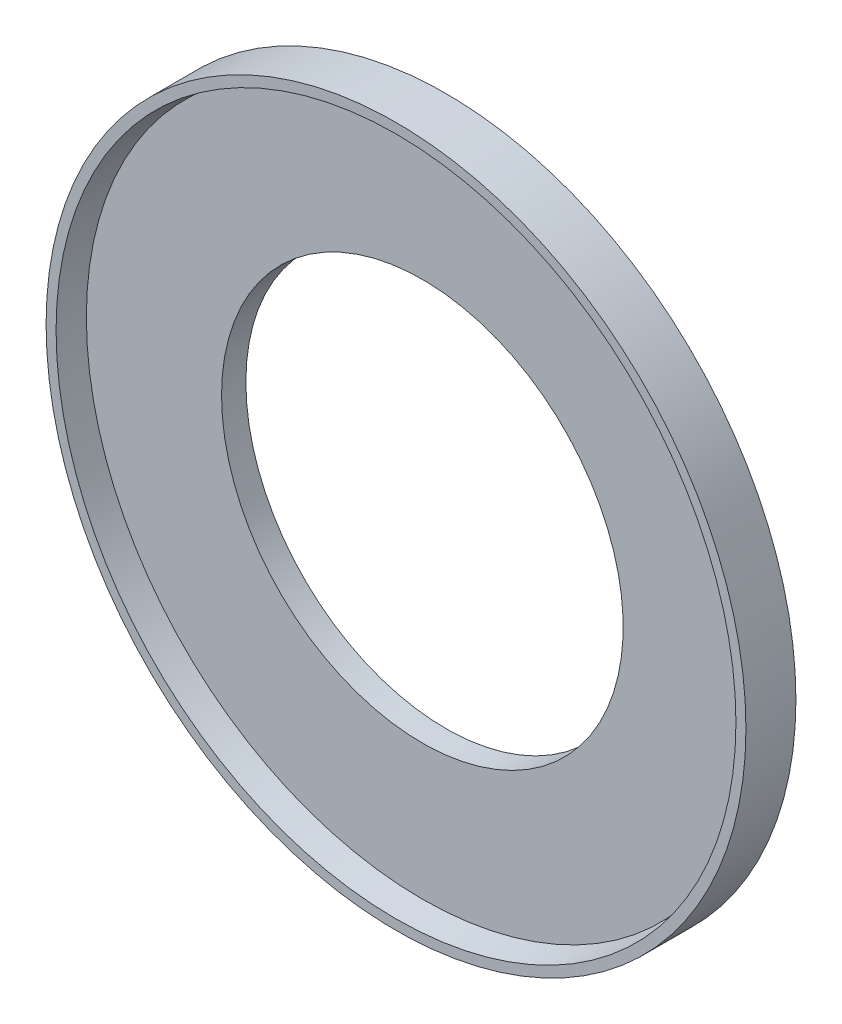
ISO-10303-21;
HEADER;
FILE_DESCRIPTION(('STEP AP214'),'2;1');
FILE_NAME('part.step','',(''),(''),'','','');
FILE_SCHEMA(('AUTOMOTIVE_DESIGN { 1 0 10303 214 1 1 1 1 }'));
ENDSEC;
DATA;
#1=APPLICATION_CONTEXT('core data for automotive mechanical design processes');
#2=APPLICATION_PROTOCOL_DEFINITION('international standard','automotive_design',2000,#1);
#3=PRODUCT_CONTEXT('',#1,'mechanical');
#4=PRODUCT('Part','Part','',(#3));
#5=PRODUCT_RELATED_PRODUCT_CATEGORY('part','',(#4));
#6=PRODUCT_DEFINITION_FORMATION('','',#4);
#7=PRODUCT_DEFINITION_CONTEXT('part definition',#1,'design');
#8=PRODUCT_DEFINITION('design','',#6,#7);
#9=PRODUCT_DEFINITION_SHAPE('','',#8);
#10=(LENGTH_UNIT() NAMED_UNIT(*) SI_UNIT(.MILLI.,.METRE.));
#11=(NAMED_UNIT(*) PLANE_ANGLE_UNIT() SI_UNIT($,.RADIAN.));
#12=(NAMED_UNIT(*) SI_UNIT($,.STERADIAN.) SOLID_ANGLE_UNIT());
#13=UNCERTAINTY_MEASURE_WITH_UNIT(LENGTH_MEASURE(1.E-05),#10,'distance_accuracy_value','');
#14=(GEOMETRIC_REPRESENTATION_CONTEXT(3) GLOBAL_UNCERTAINTY_ASSIGNED_CONTEXT((#13)) GLOBAL_UNIT_ASSIGNED_CONTEXT((#10,
#11,#12)) REPRESENTATION_CONTEXT('',''));
#15=CARTESIAN_POINT('',(0.,0.,0.));
#16=DIRECTION('',(0.,0.,1.));
#17=DIRECTION('',(1.,0.,0.));
#18=AXIS2_PLACEMENT_3D('',#15,#16,#17);
#19=CARTESIAN_POINT('',(0.,0.,0.));
#20=DIRECTION('',(0.,0.,-1.));
#21=DIRECTION('',(-1.,0.,0.));
#22=AXIS2_PLACEMENT_3D('',#19,#20,#21);
#23=CONICAL_SURFACE('',#22,6.7,0.643551175484221);
#24=CARTESIAN_POINT('',(0.,0.,0.272728964590115));
#25=DIRECTION('',(0.,0.,-1.));
#26=DIRECTION('',(-1.,0.,0.));
#27=AXIS2_PLACEMENT_3D('',#24,#25,#26);
#28=CIRCLE('',#27,6.49543194038625);
#29=CARTESIAN_POINT('',(-6.49543194038625,0.,0.272728964590115));
#30=VERTEX_POINT('',#29);
#31=EDGE_CURVE('E65',#30,#30,#28,.T.);
#32=ORIENTED_EDGE('',*,*,#31,.F.);
#33=EDGE_LOOP('',(#32));
#34=FACE_BOUND('',#33,.T.);
#35=CARTESIAN_POINT('',(0.,0.,0.));
#36=DIRECTION('',(0.,0.,-1.));
#37=DIRECTION('',(-1.,0.,0.));
#38=AXIS2_PLACEMENT_3D('',#35,#36,#37);
#39=CIRCLE('',#38,6.7);
#40=CARTESIAN_POINT('',(-6.7,0.,0.));
#41=VERTEX_POINT('',#40);
#42=EDGE_CURVE('E10',#41,#41,#39,.T.);
#43=ORIENTED_EDGE('',*,*,#42,.T.);
#44=EDGE_LOOP('',(#43));
#45=FACE_BOUND('',#44,.T.);
#46=ADVANCED_FACE('F31',(#34,#45),#23,.F.);
#47=CARTESIAN_POINT('',(7.,0.,0.));
#48=DIRECTION('',(0.,0.,1.));
#49=DIRECTION('',(1.,0.,0.));
#50=AXIS2_PLACEMENT_3D('',#47,#48,#49);
#51=PLANE('',#50);
#52=ORIENTED_EDGE('',*,*,#42,.F.);
#53=EDGE_LOOP('',(#52));
#54=FACE_BOUND('',#53,.T.);
#55=CARTESIAN_POINT('',(0.,0.,0.));
#56=DIRECTION('',(0.,0.,-1.));
#57=DIRECTION('',(-1.,0.,0.));
#58=AXIS2_PLACEMENT_3D('',#55,#56,#57);
#59=CIRCLE('',#58,7.);
#60=CARTESIAN_POINT('',(-7.,0.,0.));
#61=VERTEX_POINT('',#60);
#62=EDGE_CURVE('E37',#61,#61,#59,.T.);
#63=ORIENTED_EDGE('',*,*,#62,.T.);
#64=EDGE_LOOP('',(#63));
#65=FACE_BOUND('',#64,.T.);
#66=ADVANCED_FACE('F72',(#54,#65),#51,.F.);
#67=CARTESIAN_POINT('',(0.,0.,0.));
#68=DIRECTION('',(0.,0.,-1.));
#69=DIRECTION('',(-1.,0.,0.));
#70=AXIS2_PLACEMENT_3D('',#67,#68,#69);
#71=CYLINDRICAL_SURFACE('',#70,7.);
#72=ORIENTED_EDGE('',*,*,#62,.F.);
#73=EDGE_LOOP('',(#72));
#74=FACE_BOUND('',#73,.T.);
#75=CARTESIAN_POINT('',(0.,0.,1.));
#76=DIRECTION('',(0.,0.,-1.));
#77=DIRECTION('',(-1.,0.,0.));
#78=AXIS2_PLACEMENT_3D('',#75,#76,#77);
#79=CIRCLE('',#78,7.);
#80=CARTESIAN_POINT('',(-7.,0.,1.));
#81=VERTEX_POINT('',#80);
#82=EDGE_CURVE('E41',#81,#81,#79,.T.);
#83=ORIENTED_EDGE('',*,*,#82,.T.);
#84=EDGE_LOOP('',(#83));
#85=FACE_BOUND('',#84,.T.);
#86=ADVANCED_FACE('F76',(#74,#85),#71,.T.);
#87=CARTESIAN_POINT('',(6.8,0.,1.));
#88=DIRECTION('',(0.,0.,-1.));
#89=DIRECTION('',(-1.,0.,0.));
#90=AXIS2_PLACEMENT_3D('',#87,#88,#89);
#91=PLANE('',#90);
#92=ORIENTED_EDGE('',*,*,#82,.F.);
#93=EDGE_LOOP('',(#92));
#94=FACE_BOUND('',#93,.T.);
#95=CARTESIAN_POINT('',(0.,0.,1.));
#96=DIRECTION('',(0.,0.,-1.));
#97=DIRECTION('',(-1.,0.,0.));
#98=AXIS2_PLACEMENT_3D('',#95,#96,#97);
#99=CIRCLE('',#98,6.8);
#100=CARTESIAN_POINT('',(-6.8,0.,1.));
#101=VERTEX_POINT('',#100);
#102=EDGE_CURVE('E45',#101,#101,#99,.T.);
#103=ORIENTED_EDGE('',*,*,#102,.T.);
#104=EDGE_LOOP('',(#103));
#105=FACE_BOUND('',#104,.T.);
#106=ADVANCED_FACE('F81',(#94,#105),#91,.F.);
#107=CARTESIAN_POINT('',(0.,0.,0.472728964590116));
#108=DIRECTION('',(0.,0.,1.));
#109=DIRECTION('',(1.,0.,0.));
#110=AXIS2_PLACEMENT_3D('',#107,#108,#109);
#111=CONICAL_SURFACE('',#110,6.72141511579235,0.147951699341581);
#112=ORIENTED_EDGE('',*,*,#102,.F.);
#113=EDGE_LOOP('',(#112));
#114=FACE_BOUND('',#113,.T.);
#115=CARTESIAN_POINT('',(0.,0.,0.472728964590116));
#116=DIRECTION('',(0.,0.,-1.));
#117=DIRECTION('',(-1.,0.,0.));
#118=AXIS2_PLACEMENT_3D('',#115,#116,#117);
#119=CIRCLE('',#118,6.72141511579235);
#120=CARTESIAN_POINT('',(-6.72141511579235,0.,0.472728964590116));
#121=VERTEX_POINT('',#120);
#122=EDGE_CURVE('E50',#121,#121,#119,.T.);
#123=ORIENTED_EDGE('',*,*,#122,.T.);
#124=EDGE_LOOP('',(#123));
#125=FACE_BOUND('',#124,.T.);
#126=ADVANCED_FACE('F87',(#114,#125),#111,.F.);
#127=CARTESIAN_POINT('',(4.01726778133885,0.,0.472728964590116));
#128=DIRECTION('',(0.,0.,-1.));
#129=DIRECTION('',(-1.,0.,0.));
#130=AXIS2_PLACEMENT_3D('',#127,#128,#129);
#131=PLANE('',#130);
#132=ORIENTED_EDGE('',*,*,#122,.F.);
#133=EDGE_LOOP('',(#132));
#134=FACE_BOUND('',#133,.T.);
#135=CARTESIAN_POINT('',(0.,0.,0.472728964590116));
#136=DIRECTION('',(0.,0.,-1.));
#137=DIRECTION('',(-1.,0.,0.));
#138=AXIS2_PLACEMENT_3D('',#135,#136,#137);
#139=CIRCLE('',#138,4.01726778133885);
#140=CARTESIAN_POINT('',(-4.01726778133885,0.,0.472728964590116));
#141=VERTEX_POINT('',#140);
#142=EDGE_CURVE('E53',#141,#141,#139,.T.);
#143=ORIENTED_EDGE('',*,*,#142,.T.);
#144=EDGE_LOOP('',(#143));
#145=FACE_BOUND('',#144,.T.);
#146=ADVANCED_FACE('F91',(#134,#145),#131,.F.);
#147=CARTESIAN_POINT('',(0.,0.,0.));
#148=DIRECTION('',(0.,0.,1.));
#149=DIRECTION('',(1.,0.,0.));
#150=AXIS2_PLACEMENT_3D('',#147,#148,#149);
#151=CONICAL_SURFACE('',#150,4.00361807098559,0.0288662635609532);
#152=ORIENTED_EDGE('',*,*,#142,.F.);
#153=EDGE_LOOP('',(#152));
#154=FACE_BOUND('',#153,.T.);
#155=CARTESIAN_POINT('',(0.,0.,0.));
#156=DIRECTION('',(0.,0.,-1.));
#157=DIRECTION('',(-1.,0.,0.));
#158=AXIS2_PLACEMENT_3D('',#155,#156,#157);
#159=CIRCLE('',#158,4.00361807098559);
#160=CARTESIAN_POINT('',(-4.00361807098559,0.,0.));
#161=VERTEX_POINT('',#160);
#162=EDGE_CURVE('E56',#161,#161,#159,.T.);
#163=ORIENTED_EDGE('',*,*,#162,.T.);
#164=EDGE_LOOP('',(#163));
#165=FACE_BOUND('',#164,.T.);
#166=ADVANCED_FACE('F95',(#154,#165),#151,.F.);
#167=CARTESIAN_POINT('',(4.08507551373587,0.,0.));
#168=DIRECTION('',(0.,0.,1.));
#169=DIRECTION('',(1.,0.,0.));
#170=AXIS2_PLACEMENT_3D('',#167,#168,#169);
#171=PLANE('',#170);
#172=ORIENTED_EDGE('',*,*,#162,.F.);
#173=EDGE_LOOP('',(#172));
#174=FACE_BOUND('',#173,.T.);
#175=CARTESIAN_POINT('',(0.,0.,0.));
#176=DIRECTION('',(0.,0.,-1.));
#177=DIRECTION('',(-1.,0.,0.));
#178=AXIS2_PLACEMENT_3D('',#175,#176,#177);
#179=CIRCLE('',#178,4.08507551373587);
#180=CARTESIAN_POINT('',(-4.08507551373587,0.,0.));
#181=VERTEX_POINT('',#180);
#182=EDGE_CURVE('E59',#181,#181,#179,.T.);
#183=ORIENTED_EDGE('',*,*,#182,.T.);
#184=EDGE_LOOP('',(#183));
#185=FACE_BOUND('',#184,.T.);
#186=ADVANCED_FACE('F99',(#174,#185),#171,.F.);
#187=CARTESIAN_POINT('',(0.,0.,0.272728964590116));
#188=DIRECTION('',(0.,0.,1.));
#189=DIRECTION('',(1.,0.,0.));
#190=AXIS2_PLACEMENT_3D('',#187,#188,#189);
#191=CONICAL_SURFACE('',#190,4.12372665598802,0.140782453867256);
#192=ORIENTED_EDGE('',*,*,#182,.F.);
#193=EDGE_LOOP('',(#192));
#194=FACE_BOUND('',#193,.T.);
#195=CARTESIAN_POINT('',(0.,0.,0.272728964590116));
#196=DIRECTION('',(0.,0.,-1.));
#197=DIRECTION('',(-1.,0.,0.));
#198=AXIS2_PLACEMENT_3D('',#195,#196,#197);
#199=CIRCLE('',#198,4.12372665598802);
#200=CARTESIAN_POINT('',(-4.12372665598802,0.,0.272728964590116));
#201=VERTEX_POINT('',#200);
#202=EDGE_CURVE('E62',#201,#201,#199,.T.);
#203=ORIENTED_EDGE('',*,*,#202,.T.);
#204=EDGE_LOOP('',(#203));
#205=FACE_BOUND('',#204,.T.);
#206=ADVANCED_FACE('F103',(#194,#205),#191,.T.);
#207=CARTESIAN_POINT('',(6.49543194038625,0.,0.272728964590116));
#208=DIRECTION('',(0.,0.,1.));
#209=DIRECTION('',(1.,0.,0.));
#210=AXIS2_PLACEMENT_3D('',#207,#208,#209);
#211=PLANE('',#210);
#212=ORIENTED_EDGE('',*,*,#202,.F.);
#213=EDGE_LOOP('',(#212));
#214=FACE_BOUND('',#213,.T.);
#215=ORIENTED_EDGE('',*,*,#31,.T.);
#216=EDGE_LOOP('',(#215));
#217=FACE_BOUND('',#216,.T.);
#218=ADVANCED_FACE('F69',(#214,#217),#211,.F.);
#219=CLOSED_SHELL('',(#46,#66,#86,#106,#126,#146,#166,#186,#206,#218));
#220=MANIFOLD_SOLID_BREP('B2',#219);
#221=ADVANCED_BREP_SHAPE_REPRESENTATION('',(#18,#220),#14);
#222=SHAPE_DEFINITION_REPRESENTATION(#9,#221);
ENDSEC;
END-ISO-10303-21;
